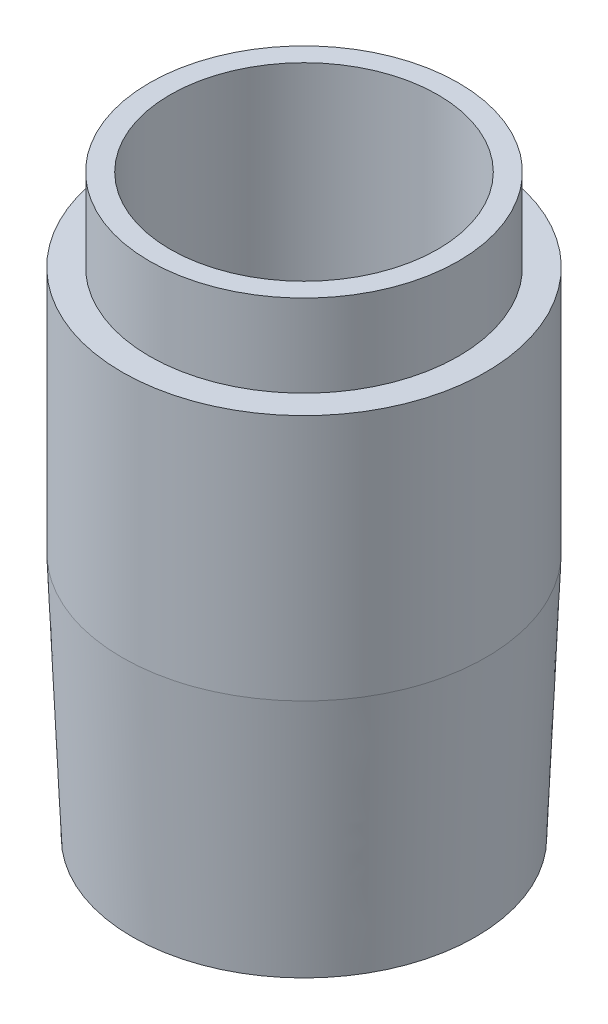
ISO-10303-21;
HEADER;
FILE_DESCRIPTION(('STEP AP214'),'2;1');
FILE_NAME('part.step','',(''),(''),'','','');
FILE_SCHEMA(('AUTOMOTIVE_DESIGN { 1 0 10303 214 1 1 1 1 }'));
ENDSEC;
DATA;
#1=APPLICATION_CONTEXT('core data for automotive mechanical design processes');
#2=APPLICATION_PROTOCOL_DEFINITION('international standard','automotive_design',2000,#1);
#3=PRODUCT_CONTEXT('',#1,'mechanical');
#4=PRODUCT('Part','Part','',(#3));
#5=PRODUCT_RELATED_PRODUCT_CATEGORY('part','',(#4));
#6=PRODUCT_DEFINITION_FORMATION('','',#4);
#7=PRODUCT_DEFINITION_CONTEXT('part definition',#1,'design');
#8=PRODUCT_DEFINITION('design','',#6,#7);
#9=PRODUCT_DEFINITION_SHAPE('','',#8);
#10=(LENGTH_UNIT() NAMED_UNIT(*) SI_UNIT(.MILLI.,.METRE.));
#11=(NAMED_UNIT(*) PLANE_ANGLE_UNIT() SI_UNIT($,.RADIAN.));
#12=(NAMED_UNIT(*) SI_UNIT($,.STERADIAN.) SOLID_ANGLE_UNIT());
#13=UNCERTAINTY_MEASURE_WITH_UNIT(LENGTH_MEASURE(1.E-05),#10,'distance_accuracy_value','');
#14=(GEOMETRIC_REPRESENTATION_CONTEXT(3) GLOBAL_UNCERTAINTY_ASSIGNED_CONTEXT((#13)) GLOBAL_UNIT_ASSIGNED_CONTEXT((#10,
#11,#12)) REPRESENTATION_CONTEXT('',''));
#15=CARTESIAN_POINT('',(0.,0.,0.));
#16=DIRECTION('',(0.,0.,1.));
#17=DIRECTION('',(1.,0.,0.));
#18=AXIS2_PLACEMENT_3D('',#15,#16,#17);
#19=CARTESIAN_POINT('',(0.,0.,0.));
#20=DIRECTION('',(0.,1.,0.));
#21=DIRECTION('',(0.,0.,1.));
#22=AXIS2_PLACEMENT_3D('',#19,#20,#21);
#23=PLANE('',#22);
#24=CARTESIAN_POINT('',(0.,0.,0.));
#25=DIRECTION('',(0.,1.,0.));
#26=DIRECTION('',(0.,0.,1.));
#27=AXIS2_PLACEMENT_3D('',#24,#25,#26);
#28=CIRCLE('',#27,6.35);
#29=CARTESIAN_POINT('',(0.,0.,6.35));
#30=VERTEX_POINT('',#29);
#31=EDGE_CURVE('E65',#30,#30,#28,.T.);
#32=ORIENTED_EDGE('',*,*,#31,.F.);
#33=EDGE_LOOP('',(#32));
#34=FACE_BOUND('',#33,.T.);
#35=CARTESIAN_POINT('',(0.,0.,0.));
#36=DIRECTION('',(0.,1.,0.));
#37=DIRECTION('',(0.,0.,1.));
#38=AXIS2_PLACEMENT_3D('',#35,#36,#37);
#39=CIRCLE('',#38,0.9525);
#40=CARTESIAN_POINT('',(0.,0.,0.9525));
#41=VERTEX_POINT('',#40);
#42=EDGE_CURVE('E13',#41,#41,#39,.F.);
#43=ORIENTED_EDGE('',*,*,#42,.F.);
#44=EDGE_LOOP('',(#43));
#45=FACE_BOUND('',#44,.T.);
#46=ADVANCED_FACE('F55',(#34,#45),#23,.F.);
#47=CARTESIAN_POINT('',(0.,18.288,0.));
#48=DIRECTION('',(0.,1.,0.));
#49=DIRECTION('',(0.,0.,1.));
#50=AXIS2_PLACEMENT_3D('',#47,#48,#49);
#51=PLANE('',#50);
#52=CARTESIAN_POINT('',(0.,18.288,0.));
#53=DIRECTION('',(0.,1.,0.));
#54=DIRECTION('',(0.,0.,1.));
#55=AXIS2_PLACEMENT_3D('',#52,#53,#54);
#56=CIRCLE('',#55,6.731);
#57=CARTESIAN_POINT('',(0.,18.288,6.731));
#58=VERTEX_POINT('',#57);
#59=EDGE_CURVE('E75',#58,#58,#56,.T.);
#60=ORIENTED_EDGE('',*,*,#59,.T.);
#61=EDGE_LOOP('',(#60));
#62=FACE_BOUND('',#61,.T.);
#63=CARTESIAN_POINT('',(0.,18.288,0.));
#64=DIRECTION('',(0.,1.,0.));
#65=DIRECTION('',(0.,0.,1.));
#66=AXIS2_PLACEMENT_3D('',#63,#64,#65);
#67=CIRCLE('',#66,5.715);
#68=CARTESIAN_POINT('',(0.,18.288,-5.715));
#69=VERTEX_POINT('',#68);
#70=EDGE_CURVE('E138',#69,#69,#67,.T.);
#71=ORIENTED_EDGE('',*,*,#70,.F.);
#72=EDGE_LOOP('',(#71));
#73=FACE_BOUND('',#72,.T.);
#74=ADVANCED_FACE('F93',(#62,#73),#51,.T.);
#75=CARTESIAN_POINT('',(0.,0.,6.35));
#76=CARTESIAN_POINT('',(0.,3.048,6.477));
#77=CARTESIAN_POINT('',(0.,6.096,6.604));
#78=CARTESIAN_POINT('',(0.,9.144,6.731));
#79=CARTESIAN_POINT('',(0.175233015650583,0.,6.35));
#80=CARTESIAN_POINT('',(0.178737675963595,3.048,6.477));
#81=CARTESIAN_POINT('',(0.182242336276606,6.096,6.604));
#82=CARTESIAN_POINT('',(0.185746996589618,9.144,6.731));
#83=CARTESIAN_POINT('',(0.522402443821633,0.,6.33577330156506));
#84=CARTESIAN_POINT('',(0.532850492698066,3.048,6.46248876759636));
#85=CARTESIAN_POINT('',(0.543298541574499,6.096,6.58920423362766));
#86=CARTESIAN_POINT('',(0.553746590450931,9.144,6.71591969965896));
#87=CARTESIAN_POINT('',(1.03162726239214,0.,6.27339267290354));
#88=CARTESIAN_POINT('',(1.05225980763998,3.048,6.39886052636162));
#89=CARTESIAN_POINT('',(1.07289235288782,6.096,6.52432837981969));
#90=CARTESIAN_POINT('',(1.09352489813567,9.144,6.64979623327776));
#91=CARTESIAN_POINT('',(1.52768324298084,0.,6.17161097752865));
#92=CARTESIAN_POINT('',(1.55823690784046,3.048,6.29504319707923));
#93=CARTESIAN_POINT('',(1.58879057270008,6.096,6.4184754166298));
#94=CARTESIAN_POINT('',(1.61934423755969,9.144,6.54190763618037));
#95=CARTESIAN_POINT('',(4.41516901284795,0.,5.33435149077339));
#96=CARTESIAN_POINT('',(4.50347239310491,3.048,5.44103852058885));
#97=CARTESIAN_POINT('',(4.59177577336186,6.096,5.54772555040432));
#98=CARTESIAN_POINT('',(4.68007915361882,9.144,5.65441258021979));
#99=CARTESIAN_POINT('',(6.35,0.,2.80372825040935));
#100=CARTESIAN_POINT('',(6.477,3.048,2.85980281541754));
#101=CARTESIAN_POINT('',(6.604,6.096,2.91587738042572));
#102=CARTESIAN_POINT('',(6.731,9.144,2.97195194543391));
#103=CARTESIAN_POINT('',(6.35,0.,-3.50466031301168));
#104=CARTESIAN_POINT('',(6.477,3.048,-3.57475351927192));
#105=CARTESIAN_POINT('',(6.604,6.096,-3.64484672553215));
#106=CARTESIAN_POINT('',(6.731,9.144,-3.71493993179239));
#107=CARTESIAN_POINT('',(3.50466031301169,0.,-6.35));
#108=CARTESIAN_POINT('',(3.57475351927192,3.048,-6.477));
#109=CARTESIAN_POINT('',(3.64484672553215,6.096,-6.604));
#110=CARTESIAN_POINT('',(3.71493993179239,9.144,-6.731));
#111=CARTESIAN_POINT('',(-3.50466031301168,0.,-6.35));
#112=CARTESIAN_POINT('',(-3.57475351927192,3.048,-6.477));
#113=CARTESIAN_POINT('',(-3.64484672553215,6.096,-6.604));
#114=CARTESIAN_POINT('',(-3.71493993179239,9.144,-6.731));
#115=CARTESIAN_POINT('',(-6.35,0.,-3.50466031301169));
#116=CARTESIAN_POINT('',(-6.477,3.048,-3.57475351927192));
#117=CARTESIAN_POINT('',(-6.604,6.096,-3.64484672553215));
#118=CARTESIAN_POINT('',(-6.731,9.144,-3.71493993179239));
#119=CARTESIAN_POINT('',(-6.35,0.,2.80372825040935));
#120=CARTESIAN_POINT('',(-6.477,3.048,2.85980281541753));
#121=CARTESIAN_POINT('',(-6.604,6.096,2.91587738042572));
#122=CARTESIAN_POINT('',(-6.731,9.144,2.97195194543391));
#123=CARTESIAN_POINT('',(-4.41516901284795,0.,5.33435149077339));
#124=CARTESIAN_POINT('',(-4.50347239310491,3.048,5.44103852058885));
#125=CARTESIAN_POINT('',(-4.59177577336187,6.096,5.54772555040432));
#126=CARTESIAN_POINT('',(-4.68007915361882,9.144,5.65441258021979));
#127=CARTESIAN_POINT('',(-1.52768324298085,0.,6.17161097752865));
#128=CARTESIAN_POINT('',(-1.55823690784046,3.048,6.29504319707923));
#129=CARTESIAN_POINT('',(-1.58879057270008,6.096,6.4184754166298));
#130=CARTESIAN_POINT('',(-1.6193442375597,9.144,6.54190763618037));
#131=CARTESIAN_POINT('',(-1.03162726239214,0.,6.27339267290354));
#132=CARTESIAN_POINT('',(-1.05225980763998,3.048,6.39886052636162));
#133=CARTESIAN_POINT('',(-1.07289235288783,6.096,6.52432837981969));
#134=CARTESIAN_POINT('',(-1.09352489813567,9.144,6.64979623327776));
#135=CARTESIAN_POINT('',(-0.522402443821637,0.,6.33577330156506));
#136=CARTESIAN_POINT('',(-0.532850492698069,3.048,6.46248876759636));
#137=CARTESIAN_POINT('',(-0.543298541574502,6.096,6.58920423362766));
#138=CARTESIAN_POINT('',(-0.553746590450935,9.144,6.71591969965896));
#139=CARTESIAN_POINT('',(-0.175233015650585,0.,6.35));
#140=CARTESIAN_POINT('',(-0.178737675963596,3.048,6.477));
#141=CARTESIAN_POINT('',(-0.182242336276608,6.096,6.604));
#142=CARTESIAN_POINT('',(-0.18574699658962,9.144,6.731));
#143=CARTESIAN_POINT('',(0.,0.,6.35));
#144=CARTESIAN_POINT('',(0.,3.048,6.477));
#145=CARTESIAN_POINT('',(0.,6.096,6.604));
#146=CARTESIAN_POINT('',(0.,9.144,6.731));
#147=B_SPLINE_SURFACE_WITH_KNOTS('',3,3,((#75,#76,#77,#78),(#79,#80,#81,#82),(#83,#84,#85,#86),
(#87,#88,#89,#90),(#91,#92,#93,#94),(#95,#96,#97,#98),(#99,#100,#101,#102),(#103,#104,#105,
#106),(#107,#108,#109,#110),(#111,#112,#113,#114),(#115,#116,#117,#118),(#119,#120,#121,#122),
(#123,#124,#125,#126),(#127,#128,#129,#130),(#131,#132,#133,#134),(#135,#136,#137,#138),(#139,
#140,#141,#142),(#143,#144,#145,#146)),.UNSPECIFIED.,.T.,.F.,.F.,(4,1,1,1,1,2,2,2,1,1,1,1,4),(4,
4),(0.,0.0125,0.0249999999999999,0.0375000000000001,0.05,0.25,0.5,0.75,0.95,0.9625,0.975,0.9875,
1.),(0.,1.),.UNSPECIFIED.);
#148=CARTESIAN_POINT('',(0.,9.144,0.));
#149=DIRECTION('',(0.,1.,0.));
#150=DIRECTION('',(0.,0.,1.));
#151=AXIS2_PLACEMENT_3D('',#148,#149,#150);
#152=CIRCLE('',#151,6.731);
#153=CARTESIAN_POINT('',(0.,9.144,6.731));
#154=VERTEX_POINT('',#153);
#155=EDGE_CURVE('E69',#154,#154,#152,.T.);
#156=CARTESIAN_POINT('',(0.,0.,6.35));
#157=CARTESIAN_POINT('',(0.,0.0952500000000001,6.35396875));
#158=CARTESIAN_POINT('',(0.,0.1905,6.3579375));
#159=CARTESIAN_POINT('',(0.,0.381,6.365875));
#160=CARTESIAN_POINT('',(0.,0.47625,6.36984375));
#161=CARTESIAN_POINT('',(0.,0.66675,6.37778125));
#162=CARTESIAN_POINT('',(0.,0.762,6.38175));
#163=CARTESIAN_POINT('',(0.,0.9525,6.3896875));
#164=CARTESIAN_POINT('',(0.,1.04775,6.39365625));
#165=CARTESIAN_POINT('',(0.,1.23825,6.40159375));
#166=CARTESIAN_POINT('',(0.,1.3335,6.4055625));
#167=CARTESIAN_POINT('',(0.,1.524,6.4135));
#168=CARTESIAN_POINT('',(0.,1.61925,6.41746875));
#169=CARTESIAN_POINT('',(0.,1.80975,6.42540625));
#170=CARTESIAN_POINT('',(0.,1.905,6.429375));
#171=CARTESIAN_POINT('',(0.,2.0955,6.4373125));
#172=CARTESIAN_POINT('',(0.,2.19075,6.44128125));
#173=CARTESIAN_POINT('',(0.,2.38125,6.44921875));
#174=CARTESIAN_POINT('',(0.,2.4765,6.4531875));
#175=CARTESIAN_POINT('',(0.,2.667,6.461125));
#176=CARTESIAN_POINT('',(0.,2.76225,6.46509375));
#177=CARTESIAN_POINT('',(0.,2.95275,6.47303125));
#178=CARTESIAN_POINT('',(0.,3.048,6.477));
#179=CARTESIAN_POINT('',(0.,3.2385,6.4849375));
#180=CARTESIAN_POINT('',(0.,3.33375,6.48890625));
#181=CARTESIAN_POINT('',(0.,3.52425,6.49684375));
#182=CARTESIAN_POINT('',(0.,3.6195,6.5008125));
#183=CARTESIAN_POINT('',(0.,3.81,6.50875));
#184=CARTESIAN_POINT('',(0.,3.90525,6.51271875));
#185=CARTESIAN_POINT('',(0.,4.09575,6.52065625));
#186=CARTESIAN_POINT('',(0.,4.191,6.524625));
#187=CARTESIAN_POINT('',(0.,4.3815,6.5325625));
#188=CARTESIAN_POINT('',(0.,4.47675,6.53653125));
#189=CARTESIAN_POINT('',(0.,4.66725,6.54446875));
#190=CARTESIAN_POINT('',(0.,4.7625,6.5484375));
#191=CARTESIAN_POINT('',(0.,4.953,6.556375));
#192=CARTESIAN_POINT('',(0.,5.04825,6.56034375));
#193=CARTESIAN_POINT('',(0.,5.23875,6.56828125));
#194=CARTESIAN_POINT('',(0.,5.334,6.57225));
#195=CARTESIAN_POINT('',(0.,5.5245,6.5801875));
#196=CARTESIAN_POINT('',(0.,5.61975,6.58415625));
#197=CARTESIAN_POINT('',(0.,5.81025,6.59209375));
#198=CARTESIAN_POINT('',(0.,5.9055,6.5960625));
#199=CARTESIAN_POINT('',(0.,6.096,6.604));
#200=CARTESIAN_POINT('',(0.,6.19125,6.60796875));
#201=CARTESIAN_POINT('',(0.,6.38175,6.61590625));
#202=CARTESIAN_POINT('',(0.,6.477,6.619875));
#203=CARTESIAN_POINT('',(0.,6.6675,6.6278125));
#204=CARTESIAN_POINT('',(0.,6.76275,6.63178125));
#205=CARTESIAN_POINT('',(0.,6.95325,6.63971875));
#206=CARTESIAN_POINT('',(0.,7.0485,6.6436875));
#207=CARTESIAN_POINT('',(0.,7.239,6.651625));
#208=CARTESIAN_POINT('',(0.,7.33425,6.65559375));
#209=CARTESIAN_POINT('',(0.,7.52475,6.66353125));
#210=CARTESIAN_POINT('',(0.,7.62,6.6675));
#211=CARTESIAN_POINT('',(0.,7.8105,6.6754375));
#212=CARTESIAN_POINT('',(0.,7.90575,6.67940625));
#213=CARTESIAN_POINT('',(0.,8.09625,6.68734375));
#214=CARTESIAN_POINT('',(0.,8.1915,6.6913125));
#215=CARTESIAN_POINT('',(0.,8.382,6.69925));
#216=CARTESIAN_POINT('',(0.,8.47725,6.70321875));
#217=CARTESIAN_POINT('',(0.,8.66775,6.71115625));
#218=CARTESIAN_POINT('',(0.,8.763,6.715125));
#219=CARTESIAN_POINT('',(0.,8.9535,6.7230625));
#220=CARTESIAN_POINT('',(0.,9.04875,6.72703125));
#221=CARTESIAN_POINT('',(0.,9.144,6.731));
#222=B_SPLINE_CURVE_WITH_KNOTS('',3,(#156,#157,#158,#159,#160,#161,#162,#163,#164,#165,#166,
#167,#168,#169,#170,#171,#172,#173,#174,#175,#176,#177,#178,#179,#180,#181,#182,#183,#184,#185,
#186,#187,#188,#189,#190,#191,#192,#193,#194,#195,#196,#197,#198,#199,#200,#201,#202,#203,#204,
#205,#206,#207,#208,#209,#210,#211,#212,#213,#214,#215,#216,#217,#218,#219,#220,#221),
.UNSPECIFIED.,.F.,.F.,(4,2,2,2,2,2,2,2,2,2,2,2,2,2,2,2,2,2,2,2,2,2,2,2,2,2,2,2,2,2,2,2,4),(0.,
0.285997939309119,0.571995878618238,0.857993817927357,1.14399175723648,1.42998969654559,
1.71598763585471,2.00198557516383,2.28798351447295,2.57398145378207,2.85997939309119,
3.14597733240031,3.43197527170943,3.71797321101855,4.00397115032766,4.28996908963678,
4.5759670289459,4.86196496825502,5.14796290756414,5.43396084687326,5.71995878618238,
6.0059567254915,6.29195466480062,6.57795260410974,6.86395054341886,7.14994848272798,
7.4359464220371,7.72194436134621,8.00794230065534,8.29394023996445,8.57993817927357,
8.86593611858269,9.15193405789181),.UNSPECIFIED.);
#223=EDGE_CURVE('BSEAM57',#30,#154,#222,.T.);
#224=ORIENTED_EDGE('',*,*,#31,.T.);
#225=ORIENTED_EDGE('',*,*,#155,.F.);
#226=ORIENTED_EDGE('',*,*,#223,.T.);
#227=ORIENTED_EDGE('',*,*,#223,.F.);
#228=EDGE_LOOP('',(#224,#226,#225,#227));
#229=FACE_BOUND('',#228,.T.);
#230=ADVANCED_FACE('F57',(#229),#147,.T.);
#231=CARTESIAN_POINT('',(0.,55.6141429766666,0.));
#232=DIRECTION('',(0.,-1.,0.));
#233=DIRECTION('',(0.,0.,-1.));
#234=AXIS2_PLACEMENT_3D('',#231,#232,#233);
#235=CYLINDRICAL_SURFACE('',#234,6.731);
#236=ORIENTED_EDGE('',*,*,#155,.T.);
#237=EDGE_LOOP('',(#236));
#238=FACE_BOUND('',#237,.T.);
#239=ORIENTED_EDGE('',*,*,#59,.F.);
#240=EDGE_LOOP('',(#239));
#241=FACE_BOUND('',#240,.T.);
#242=ADVANCED_FACE('F98',(#238,#241),#235,.T.);
#243=CARTESIAN_POINT('',(0.,21.336,0.));
#244=DIRECTION('',(0.,-1.,0.));
#245=DIRECTION('',(0.,0.,-1.));
#246=AXIS2_PLACEMENT_3D('',#243,#244,#245);
#247=CYLINDRICAL_SURFACE('',#246,5.715);
#248=CARTESIAN_POINT('',(0.,21.336,0.));
#249=DIRECTION('',(0.,1.,0.));
#250=DIRECTION('',(0.,0.,1.));
#251=AXIS2_PLACEMENT_3D('',#248,#249,#250);
#252=CIRCLE('',#251,5.715);
#253=CARTESIAN_POINT('',(0.,21.336,-5.715));
#254=VERTEX_POINT('',#253);
#255=EDGE_CURVE('E136',#254,#254,#252,.T.);
#256=CARTESIAN_POINT('',(0.,21.336,-5.715));
#257=CARTESIAN_POINT('',(0.,21.30425,-5.715));
#258=CARTESIAN_POINT('',(0.,21.2725,-5.715));
#259=CARTESIAN_POINT('',(0.,21.209,-5.715));
#260=CARTESIAN_POINT('',(0.,21.17725,-5.715));
#261=CARTESIAN_POINT('',(0.,21.11375,-5.715));
#262=CARTESIAN_POINT('',(0.,21.082,-5.715));
#263=CARTESIAN_POINT('',(0.,21.0185,-5.715));
#264=CARTESIAN_POINT('',(0.,20.98675,-5.715));
#265=CARTESIAN_POINT('',(0.,20.92325,-5.715));
#266=CARTESIAN_POINT('',(0.,20.8915,-5.715));
#267=CARTESIAN_POINT('',(0.,20.828,-5.715));
#268=CARTESIAN_POINT('',(0.,20.79625,-5.715));
#269=CARTESIAN_POINT('',(0.,20.73275,-5.715));
#270=CARTESIAN_POINT('',(0.,20.701,-5.715));
#271=CARTESIAN_POINT('',(0.,20.6375,-5.715));
#272=CARTESIAN_POINT('',(0.,20.60575,-5.715));
#273=CARTESIAN_POINT('',(0.,20.54225,-5.715));
#274=CARTESIAN_POINT('',(0.,20.5105,-5.715));
#275=CARTESIAN_POINT('',(0.,20.447,-5.715));
#276=CARTESIAN_POINT('',(0.,20.41525,-5.715));
#277=CARTESIAN_POINT('',(0.,20.35175,-5.715));
#278=CARTESIAN_POINT('',(0.,20.32,-5.715));
#279=CARTESIAN_POINT('',(0.,20.2565,-5.715));
#280=CARTESIAN_POINT('',(0.,20.22475,-5.715));
#281=CARTESIAN_POINT('',(0.,20.16125,-5.715));
#282=CARTESIAN_POINT('',(0.,20.1295,-5.715));
#283=CARTESIAN_POINT('',(0.,20.066,-5.715));
#284=CARTESIAN_POINT('',(0.,20.03425,-5.715));
#285=CARTESIAN_POINT('',(0.,19.97075,-5.715));
#286=CARTESIAN_POINT('',(0.,19.939,-5.715));
#287=CARTESIAN_POINT('',(0.,19.8755,-5.715));
#288=CARTESIAN_POINT('',(0.,19.84375,-5.715));
#289=CARTESIAN_POINT('',(0.,19.78025,-5.715));
#290=CARTESIAN_POINT('',(0.,19.7485,-5.715));
#291=CARTESIAN_POINT('',(0.,19.685,-5.715));
#292=CARTESIAN_POINT('',(0.,19.65325,-5.715));
#293=CARTESIAN_POINT('',(0.,19.58975,-5.715));
#294=CARTESIAN_POINT('',(0.,19.558,-5.715));
#295=CARTESIAN_POINT('',(0.,19.4945,-5.715));
#296=CARTESIAN_POINT('',(0.,19.46275,-5.715));
#297=CARTESIAN_POINT('',(0.,19.39925,-5.715));
#298=CARTESIAN_POINT('',(0.,19.3675,-5.715));
#299=CARTESIAN_POINT('',(0.,19.304,-5.715));
#300=CARTESIAN_POINT('',(0.,19.27225,-5.715));
#301=CARTESIAN_POINT('',(0.,19.20875,-5.715));
#302=CARTESIAN_POINT('',(0.,19.177,-5.715));
#303=CARTESIAN_POINT('',(0.,19.1135,-5.715));
#304=CARTESIAN_POINT('',(0.,19.08175,-5.715));
#305=CARTESIAN_POINT('',(0.,19.01825,-5.715));
#306=CARTESIAN_POINT('',(0.,18.9865,-5.715));
#307=CARTESIAN_POINT('',(0.,18.923,-5.715));
#308=CARTESIAN_POINT('',(0.,18.89125,-5.715));
#309=CARTESIAN_POINT('',(0.,18.82775,-5.715));
#310=CARTESIAN_POINT('',(0.,18.796,-5.715));
#311=CARTESIAN_POINT('',(0.,18.7325,-5.715));
#312=CARTESIAN_POINT('',(0.,18.70075,-5.715));
#313=CARTESIAN_POINT('',(0.,18.63725,-5.715));
#314=CARTESIAN_POINT('',(0.,18.6055,-5.715));
#315=CARTESIAN_POINT('',(0.,18.542,-5.715));
#316=CARTESIAN_POINT('',(0.,18.51025,-5.715));
#317=CARTESIAN_POINT('',(0.,18.44675,-5.715));
#318=CARTESIAN_POINT('',(0.,18.415,-5.715));
#319=CARTESIAN_POINT('',(0.,18.3515,-5.715));
#320=CARTESIAN_POINT('',(0.,18.31975,-5.715));
#321=CARTESIAN_POINT('',(0.,18.288,-5.715));
#322=B_SPLINE_CURVE_WITH_KNOTS('',3,(#256,#257,#258,#259,#260,#261,#262,#263,#264,#265,#266,
#267,#268,#269,#270,#271,#272,#273,#274,#275,#276,#277,#278,#279,#280,#281,#282,#283,#284,#285,
#286,#287,#288,#289,#290,#291,#292,#293,#294,#295,#296,#297,#298,#299,#300,#301,#302,#303,#304,
#305,#306,#307,#308,#309,#310,#311,#312,#313,#314,#315,#316,#317,#318,#319,#320,#321),
.UNSPECIFIED.,.F.,.F.,(4,2,2,2,2,2,2,2,2,2,2,2,2,2,2,2,2,2,2,2,2,2,2,2,2,2,2,2,2,2,2,2,4),(0.,
0.0952500000000016,0.190500000000003,0.285750000000001,0.381000000000003,0.476250000000001,
0.571500000000003,0.666750000000001,0.762000000000002,0.85725,0.952500000000002,1.04775,1.143,
1.23825,1.3335,1.42875,1.524,1.61925,1.7145,1.80975,1.905,2.00025,2.0955,2.19075,2.286,2.38125,
2.4765,2.57175,2.667,2.76225,2.8575,2.95275,3.048),.UNSPECIFIED.);
#323=EDGE_CURVE('BSEAM102',#254,#69,#322,.T.);
#324=ORIENTED_EDGE('',*,*,#255,.F.);
#325=ORIENTED_EDGE('',*,*,#70,.T.);
#326=ORIENTED_EDGE('',*,*,#323,.T.);
#327=ORIENTED_EDGE('',*,*,#323,.F.);
#328=EDGE_LOOP('',(#324,#326,#325,#327));
#329=FACE_BOUND('',#328,.T.);
#330=ADVANCED_FACE('F102',(#329),#247,.T.);
#331=CARTESIAN_POINT('',(0.,21.336,0.));
#332=DIRECTION('',(0.,1.,0.));
#333=DIRECTION('',(0.,0.,1.));
#334=AXIS2_PLACEMENT_3D('',#331,#332,#333);
#335=PLANE('',#334);
#336=CARTESIAN_POINT('',(0.,21.336,0.));
#337=DIRECTION('',(0.,1.,0.));
#338=DIRECTION('',(0.,0.,1.));
#339=AXIS2_PLACEMENT_3D('',#336,#337,#338);
#340=CIRCLE('',#339,4.953);
#341=CARTESIAN_POINT('',(0.,21.336,4.953));
#342=VERTEX_POINT('',#341);
#343=EDGE_CURVE('E146',#342,#342,#340,.T.);
#344=ORIENTED_EDGE('',*,*,#343,.F.);
#345=EDGE_LOOP('',(#344));
#346=FACE_BOUND('',#345,.T.);
#347=ORIENTED_EDGE('',*,*,#255,.T.);
#348=EDGE_LOOP('',(#347));
#349=FACE_BOUND('',#348,.T.);
#350=ADVANCED_FACE('F169',(#346,#349),#335,.T.);
#351=CARTESIAN_POINT('',(0.,-14.0091995488679,0.));
#352=DIRECTION('',(0.,1.,0.));
#353=DIRECTION('',(0.,0.,1.));
#354=AXIS2_PLACEMENT_3D('',#351,#352,#353);
#355=CYLINDRICAL_SURFACE('',#354,4.953);
#356=CARTESIAN_POINT('',(0.,1.27,0.));
#357=DIRECTION('',(0.,1.,0.));
#358=DIRECTION('',(0.,0.,1.));
#359=AXIS2_PLACEMENT_3D('',#356,#357,#358);
#360=CIRCLE('',#359,4.953);
#361=CARTESIAN_POINT('',(0.,1.27,4.953));
#362=VERTEX_POINT('',#361);
#363=EDGE_CURVE('E142',#362,#362,#360,.F.);
#364=ORIENTED_EDGE('',*,*,#363,.T.);
#365=EDGE_LOOP('',(#364));
#366=FACE_BOUND('',#365,.T.);
#367=ORIENTED_EDGE('',*,*,#343,.T.);
#368=EDGE_LOOP('',(#367));
#369=FACE_BOUND('',#368,.T.);
#370=ADVANCED_FACE('F164',(#366,#369),#355,.F.);
#371=CARTESIAN_POINT('',(0.,1.27,0.));
#372=DIRECTION('',(0.,1.,0.));
#373=DIRECTION('',(0.,0.,1.));
#374=AXIS2_PLACEMENT_3D('',#371,#372,#373);
#375=PLANE('',#374);
#376=ORIENTED_EDGE('',*,*,#363,.F.);
#377=EDGE_LOOP('',(#376));
#378=FACE_BOUND('',#377,.T.);
#379=ADVANCED_FACE('F157',(#378),#375,.T.);
#380=CARTESIAN_POINT('',(0.,-2.54,0.));
#381=DIRECTION('',(0.,1.,0.));
#382=DIRECTION('',(0.,0.,1.));
#383=AXIS2_PLACEMENT_3D('',#380,#381,#382);
#384=CYLINDRICAL_SURFACE('',#383,0.9525);
#385=CARTESIAN_POINT('',(0.,-2.54,0.));
#386=DIRECTION('',(0.,-1.,0.));
#387=DIRECTION('',(0.,0.,-1.));
#388=AXIS2_PLACEMENT_3D('',#385,#386,#387);
#389=CIRCLE('',#388,0.9525);
#390=CARTESIAN_POINT('',(0.,-2.54,-0.9525));
#391=VERTEX_POINT('',#390);
#392=EDGE_CURVE('E149',#391,#391,#389,.T.);
#393=ORIENTED_EDGE('',*,*,#392,.F.);
#394=EDGE_LOOP('',(#393));
#395=FACE_BOUND('',#394,.T.);
#396=ORIENTED_EDGE('',*,*,#42,.T.);
#397=EDGE_LOOP('',(#396));
#398=FACE_BOUND('',#397,.T.);
#399=ADVANCED_FACE('F155',(#395,#398),#384,.T.);
#400=CARTESIAN_POINT('',(0.,-2.54,0.));
#401=DIRECTION('',(0.,-1.,0.));
#402=DIRECTION('',(0.,0.,-1.));
#403=AXIS2_PLACEMENT_3D('',#400,#401,#402);
#404=PLANE('',#403);
#405=ORIENTED_EDGE('',*,*,#392,.T.);
#406=EDGE_LOOP('',(#405));
#407=FACE_BOUND('',#406,.T.);
#408=ADVANCED_FACE('F153',(#407),#404,.T.);
#409=CLOSED_SHELL('',(#46,#74,#230,#242,#330,#350,#370,#379,#399,#408));
#410=MANIFOLD_SOLID_BREP('B2',#409);
#411=ADVANCED_BREP_SHAPE_REPRESENTATION('',(#18,#410),#14);
#412=SHAPE_DEFINITION_REPRESENTATION(#9,#411);
ENDSEC;
END-ISO-10303-21;
